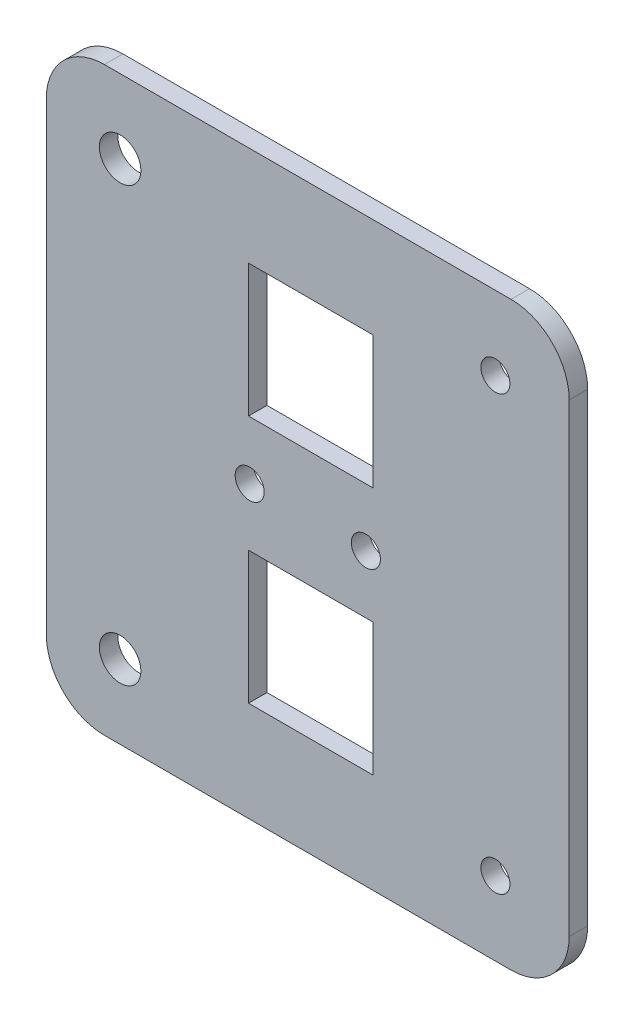
ISO-10303-21;
HEADER;
FILE_DESCRIPTION(('STEP AP214'),'2;1');
FILE_NAME('part.step','',(''),(''),'','','');
FILE_SCHEMA(('AUTOMOTIVE_DESIGN { 1 0 10303 214 1 1 1 1 }'));
ENDSEC;
DATA;
#1=APPLICATION_CONTEXT('core data for automotive mechanical design processes');
#2=APPLICATION_PROTOCOL_DEFINITION('international standard','automotive_design',2000,#1);
#3=PRODUCT_CONTEXT('',#1,'mechanical');
#4=PRODUCT('Part','Part','',(#3));
#5=PRODUCT_RELATED_PRODUCT_CATEGORY('part','',(#4));
#6=PRODUCT_DEFINITION_FORMATION('','',#4);
#7=PRODUCT_DEFINITION_CONTEXT('part definition',#1,'design');
#8=PRODUCT_DEFINITION('design','',#6,#7);
#9=PRODUCT_DEFINITION_SHAPE('','',#8);
#10=(LENGTH_UNIT() NAMED_UNIT(*) SI_UNIT(.MILLI.,.METRE.));
#11=(NAMED_UNIT(*) PLANE_ANGLE_UNIT() SI_UNIT($,.RADIAN.));
#12=(NAMED_UNIT(*) SI_UNIT($,.STERADIAN.) SOLID_ANGLE_UNIT());
#13=UNCERTAINTY_MEASURE_WITH_UNIT(LENGTH_MEASURE(1.E-05),#10,'distance_accuracy_value','');
#14=(GEOMETRIC_REPRESENTATION_CONTEXT(3) GLOBAL_UNCERTAINTY_ASSIGNED_CONTEXT((#13)) GLOBAL_UNIT_ASSIGNED_CONTEXT((#10,
#11,#12)) REPRESENTATION_CONTEXT('',''));
#15=CARTESIAN_POINT('',(0.,0.,0.));
#16=DIRECTION('',(0.,0.,1.));
#17=DIRECTION('',(1.,0.,0.));
#18=AXIS2_PLACEMENT_3D('',#15,#16,#17);
#19=CARTESIAN_POINT('',(-45.,-55.,15.98));
#20=DIRECTION('',(-1.,0.,0.));
#21=DIRECTION('',(0.,0.,1.));
#22=AXIS2_PLACEMENT_3D('',#19,#20,#21);
#23=PLANE('',#22);
#24=DIRECTION('',(0.,-1.,0.));
#25=VECTOR('',#24,1.);
#26=CARTESIAN_POINT('',(-45.,-55.,15.98));
#27=LINE('',#26,#25);
#28=CARTESIAN_POINT('',(-45.,35.,15.98));
#29=VERTEX_POINT('',#28);
#30=CARTESIAN_POINT('',(-45.,-45.,15.98));
#31=VERTEX_POINT('',#30);
#32=EDGE_CURVE('E252',#29,#31,#27,.T.);
#33=ORIENTED_EDGE('',*,*,#32,.T.);
#34=DIRECTION('',(0.,0.,1.));
#35=VECTOR('',#34,1.);
#36=CARTESIAN_POINT('',(-45.,-45.,15.98));
#37=LINE('',#36,#35);
#38=CARTESIAN_POINT('',(-45.,-45.,19.16));
#39=VERTEX_POINT('',#38);
#40=EDGE_CURVE('E303',#31,#39,#37,.T.);
#41=ORIENTED_EDGE('',*,*,#40,.T.);
#42=DIRECTION('',(0.,-1.,0.));
#43=VECTOR('',#42,1.);
#44=CARTESIAN_POINT('',(-45.,-55.,19.16));
#45=LINE('',#44,#43);
#46=CARTESIAN_POINT('',(-45.,35.,19.16));
#47=VERTEX_POINT('',#46);
#48=EDGE_CURVE('E249',#47,#39,#45,.T.);
#49=ORIENTED_EDGE('',*,*,#48,.F.);
#50=DIRECTION('',(0.,0.,1.));
#51=VECTOR('',#50,1.);
#52=CARTESIAN_POINT('',(-45.,35.,15.98));
#53=LINE('',#52,#51);
#54=EDGE_CURVE('E301',#47,#29,#53,.F.);
#55=ORIENTED_EDGE('',*,*,#54,.T.);
#56=EDGE_LOOP('',(#33,#41,#49,#55));
#57=FACE_BOUND('',#56,.T.);
#58=ADVANCED_FACE('F34',(#57),#23,.T.);
#59=CARTESIAN_POINT('',(-45.,45.,15.98));
#60=DIRECTION('',(0.,1.,0.));
#61=DIRECTION('',(0.,0.,1.));
#62=AXIS2_PLACEMENT_3D('',#59,#60,#61);
#63=PLANE('',#62);
#64=DIRECTION('',(-1.,0.,0.));
#65=VECTOR('',#64,1.);
#66=CARTESIAN_POINT('',(-45.,45.,15.98));
#67=LINE('',#66,#65);
#68=CARTESIAN_POINT('',(35.,45.,15.98));
#69=VERTEX_POINT('',#68);
#70=CARTESIAN_POINT('',(-35.,45.,15.98));
#71=VERTEX_POINT('',#70);
#72=EDGE_CURVE('E262',#69,#71,#67,.T.);
#73=ORIENTED_EDGE('',*,*,#72,.T.);
#74=DIRECTION('',(0.,0.,1.));
#75=VECTOR('',#74,1.);
#76=CARTESIAN_POINT('',(-35.,45.,15.98));
#77=LINE('',#76,#75);
#78=CARTESIAN_POINT('',(-35.,45.,19.16));
#79=VERTEX_POINT('',#78);
#80=EDGE_CURVE('E11',#71,#79,#77,.T.);
#81=ORIENTED_EDGE('',*,*,#80,.T.);
#82=DIRECTION('',(-1.,0.,0.));
#83=VECTOR('',#82,1.);
#84=CARTESIAN_POINT('',(-45.,45.,19.16));
#85=LINE('',#84,#83);
#86=CARTESIAN_POINT('',(35.,45.,19.16));
#87=VERTEX_POINT('',#86);
#88=EDGE_CURVE('E256',#87,#79,#85,.T.);
#89=ORIENTED_EDGE('',*,*,#88,.F.);
#90=DIRECTION('',(0.,0.,1.));
#91=VECTOR('',#90,1.);
#92=CARTESIAN_POINT('',(35.,45.,15.98));
#93=LINE('',#92,#91);
#94=EDGE_CURVE('E42',#87,#69,#93,.F.);
#95=ORIENTED_EDGE('',*,*,#94,.T.);
#96=EDGE_LOOP('',(#73,#81,#89,#95));
#97=FACE_BOUND('',#96,.T.);
#98=ADVANCED_FACE('F309',(#97),#63,.T.);
#99=CARTESIAN_POINT('',(45.,-55.,15.98));
#100=DIRECTION('',(1.,0.,0.));
#101=DIRECTION('',(0.,0.,-1.));
#102=AXIS2_PLACEMENT_3D('',#99,#100,#101);
#103=PLANE('',#102);
#104=DIRECTION('',(0.,1.,0.));
#105=VECTOR('',#104,1.);
#106=CARTESIAN_POINT('',(45.,-55.,19.16));
#107=LINE('',#106,#105);
#108=CARTESIAN_POINT('',(45.,-45.,19.16));
#109=VERTEX_POINT('',#108);
#110=CARTESIAN_POINT('',(45.,35.,19.16));
#111=VERTEX_POINT('',#110);
#112=EDGE_CURVE('E271',#109,#111,#107,.T.);
#113=ORIENTED_EDGE('',*,*,#112,.F.);
#114=DIRECTION('',(0.,0.,1.));
#115=VECTOR('',#114,1.);
#116=CARTESIAN_POINT('',(45.,-45.,15.98));
#117=LINE('',#116,#115);
#118=CARTESIAN_POINT('',(45.,-45.,15.98));
#119=VERTEX_POINT('',#118);
#120=EDGE_CURVE('E291',#109,#119,#117,.F.);
#121=ORIENTED_EDGE('',*,*,#120,.T.);
#122=DIRECTION('',(0.,1.,0.));
#123=VECTOR('',#122,1.);
#124=CARTESIAN_POINT('',(45.,-55.,15.98));
#125=LINE('',#124,#123);
#126=CARTESIAN_POINT('',(45.,35.,15.98));
#127=VERTEX_POINT('',#126);
#128=EDGE_CURVE('E259',#119,#127,#125,.T.);
#129=ORIENTED_EDGE('',*,*,#128,.T.);
#130=DIRECTION('',(0.,0.,1.));
#131=VECTOR('',#130,1.);
#132=CARTESIAN_POINT('',(45.,35.,15.98));
#133=LINE('',#132,#131);
#134=EDGE_CURVE('E288',#127,#111,#133,.T.);
#135=ORIENTED_EDGE('',*,*,#134,.T.);
#136=EDGE_LOOP('',(#113,#121,#129,#135));
#137=FACE_BOUND('',#136,.T.);
#138=ADVANCED_FACE('F321',(#137),#103,.T.);
#139=CARTESIAN_POINT('',(-45.,-55.,15.98));
#140=DIRECTION('',(0.,-1.,0.));
#141=DIRECTION('',(0.,0.,-1.));
#142=AXIS2_PLACEMENT_3D('',#139,#140,#141);
#143=PLANE('',#142);
#144=DIRECTION('',(1.,0.,0.));
#145=VECTOR('',#144,1.);
#146=CARTESIAN_POINT('',(-45.,-55.,15.98));
#147=LINE('',#146,#145);
#148=CARTESIAN_POINT('',(-35.,-55.,15.98));
#149=VERTEX_POINT('',#148);
#150=CARTESIAN_POINT('',(35.,-55.,15.98));
#151=VERTEX_POINT('',#150);
#152=EDGE_CURVE('E255',#149,#151,#147,.T.);
#153=ORIENTED_EDGE('',*,*,#152,.T.);
#154=DIRECTION('',(0.,0.,1.));
#155=VECTOR('',#154,1.);
#156=CARTESIAN_POINT('',(35.,-55.,15.98));
#157=LINE('',#156,#155);
#158=CARTESIAN_POINT('',(35.,-55.,19.16));
#159=VERTEX_POINT('',#158);
#160=EDGE_CURVE('E277',#151,#159,#157,.T.);
#161=ORIENTED_EDGE('',*,*,#160,.T.);
#162=DIRECTION('',(1.,0.,0.));
#163=VECTOR('',#162,1.);
#164=CARTESIAN_POINT('',(-45.,-55.,19.16));
#165=LINE('',#164,#163);
#166=CARTESIAN_POINT('',(-35.,-55.,19.16));
#167=VERTEX_POINT('',#166);
#168=EDGE_CURVE('E268',#167,#159,#165,.T.);
#169=ORIENTED_EDGE('',*,*,#168,.F.);
#170=DIRECTION('',(0.,0.,1.));
#171=VECTOR('',#170,1.);
#172=CARTESIAN_POINT('',(-35.,-55.,15.98));
#173=LINE('',#172,#171);
#174=EDGE_CURVE('E265',#167,#149,#173,.F.);
#175=ORIENTED_EDGE('',*,*,#174,.T.);
#176=EDGE_LOOP('',(#153,#161,#169,#175));
#177=FACE_BOUND('',#176,.T.);
#178=ADVANCED_FACE('F330',(#177),#143,.T.);
#179=CARTESIAN_POINT('',(0.,0.,15.98));
#180=DIRECTION('',(0.,0.,-1.));
#181=DIRECTION('',(-1.,0.,0.));
#182=AXIS2_PLACEMENT_3D('',#179,#180,#181);
#183=PLANE('',#182);
#184=DIRECTION('',(0.,1.,0.));
#185=VECTOR('',#184,1.);
#186=CARTESIAN_POINT('',(-10.2,5.00000000123002,15.98));
#187=LINE('',#186,#185);
#188=CARTESIAN_POINT('',(-10.2,5.00000000123002,15.98));
#189=VERTEX_POINT('',#188);
#190=CARTESIAN_POINT('',(-10.2,27.8105107042279,15.98));
#191=VERTEX_POINT('',#190);
#192=EDGE_CURVE('E49',#189,#191,#187,.T.);
#193=ORIENTED_EDGE('',*,*,#192,.F.);
#194=DIRECTION('',(-1.,0.,0.));
#195=VECTOR('',#194,1.);
#196=CARTESIAN_POINT('',(-10.2,5.00000000123002,15.98));
#197=LINE('',#196,#195);
#198=CARTESIAN_POINT('',(11.2,5.00000000123002,15.98));
#199=VERTEX_POINT('',#198);
#200=EDGE_CURVE('E165',#199,#189,#197,.T.);
#201=ORIENTED_EDGE('',*,*,#200,.F.);
#202=DIRECTION('',(0.,-1.,0.));
#203=VECTOR('',#202,1.);
#204=CARTESIAN_POINT('',(11.2,5.00000000123002,15.98));
#205=LINE('',#204,#203);
#206=CARTESIAN_POINT('',(11.2,27.8105107042279,15.98));
#207=VERTEX_POINT('',#206);
#208=EDGE_CURVE('E168',#207,#199,#205,.T.);
#209=ORIENTED_EDGE('',*,*,#208,.F.);
#210=DIRECTION('',(1.,0.,0.));
#211=VECTOR('',#210,1.);
#212=CARTESIAN_POINT('',(-10.2,27.8105107042279,15.98));
#213=LINE('',#212,#211);
#214=EDGE_CURVE('E174',#191,#207,#213,.T.);
#215=ORIENTED_EDGE('',*,*,#214,.F.);
#216=EDGE_LOOP('',(#193,#201,#209,#215));
#217=FACE_BOUND('',#216,.T.);
#218=DIRECTION('',(0.,1.,0.));
#219=VECTOR('',#218,1.);
#220=CARTESIAN_POINT('',(-10.2,-15.0000000012299,15.98));
#221=LINE('',#220,#219);
#222=CARTESIAN_POINT('',(-10.2,-37.8105107042278,15.98));
#223=VERTEX_POINT('',#222);
#224=CARTESIAN_POINT('',(-10.2,-15.0000000012299,15.98));
#225=VERTEX_POINT('',#224);
#226=EDGE_CURVE('E180',#223,#225,#221,.T.);
#227=ORIENTED_EDGE('',*,*,#226,.F.);
#228=DIRECTION('',(-1.,0.,0.));
#229=VECTOR('',#228,1.);
#230=CARTESIAN_POINT('',(-10.2,-37.8105107042278,15.98));
#231=LINE('',#230,#229);
#232=CARTESIAN_POINT('',(11.2,-37.8105107042278,15.98));
#233=VERTEX_POINT('',#232);
#234=EDGE_CURVE('E188',#233,#223,#231,.T.);
#235=ORIENTED_EDGE('',*,*,#234,.F.);
#236=DIRECTION('',(0.,-1.,0.));
#237=VECTOR('',#236,1.);
#238=CARTESIAN_POINT('',(11.2,-15.0000000012299,15.98));
#239=LINE('',#238,#237);
#240=CARTESIAN_POINT('',(11.2,-15.0000000012299,15.98));
#241=VERTEX_POINT('',#240);
#242=EDGE_CURVE('E202',#241,#233,#239,.T.);
#243=ORIENTED_EDGE('',*,*,#242,.F.);
#244=DIRECTION('',(1.,0.,0.));
#245=VECTOR('',#244,1.);
#246=CARTESIAN_POINT('',(-10.2,-15.0000000012299,15.98));
#247=LINE('',#246,#245);
#248=EDGE_CURVE('E199',#225,#241,#247,.T.);
#249=ORIENTED_EDGE('',*,*,#248,.F.);
#250=EDGE_LOOP('',(#227,#235,#243,#249));
#251=FACE_BOUND('',#250,.T.);
#252=CARTESIAN_POINT('',(-9.99999999999999,-4.99999999999996,15.98));
#253=DIRECTION('',(0.,0.,-1.));
#254=DIRECTION('',(-1.,0.,0.));
#255=AXIS2_PLACEMENT_3D('',#252,#253,#254);
#256=CIRCLE('',#255,2.5);
#257=CARTESIAN_POINT('',(-12.5,-4.99999999999996,15.98));
#258=VERTEX_POINT('',#257);
#259=EDGE_CURVE('E218',#258,#258,#256,.T.);
#260=ORIENTED_EDGE('',*,*,#259,.F.);
#261=EDGE_LOOP('',(#260));
#262=FACE_BOUND('',#261,.T.);
#263=CARTESIAN_POINT('',(10.,-4.99999999999995,15.98));
#264=DIRECTION('',(0.,0.,-1.));
#265=DIRECTION('',(-1.,0.,0.));
#266=AXIS2_PLACEMENT_3D('',#263,#264,#265);
#267=CIRCLE('',#266,2.5);
#268=CARTESIAN_POINT('',(7.50000000000001,-4.99999999999995,15.98));
#269=VERTEX_POINT('',#268);
#270=EDGE_CURVE('E224',#269,#269,#267,.T.);
#271=ORIENTED_EDGE('',*,*,#270,.F.);
#272=EDGE_LOOP('',(#271));
#273=FACE_BOUND('',#272,.T.);
#274=CARTESIAN_POINT('',(32.3,32.3000000000001,15.98));
#275=DIRECTION('',(0.,0.,1.));
#276=DIRECTION('',(1.,0.,0.));
#277=AXIS2_PLACEMENT_3D('',#274,#275,#276);
#278=CIRCLE('',#277,2.5);
#279=CARTESIAN_POINT('',(34.8,32.3000000000001,15.98));
#280=VERTEX_POINT('',#279);
#281=EDGE_CURVE('E228',#280,#280,#278,.T.);
#282=ORIENTED_EDGE('',*,*,#281,.T.);
#283=EDGE_LOOP('',(#282));
#284=FACE_BOUND('',#283,.T.);
#285=CARTESIAN_POINT('',(-32.3,32.3,15.98));
#286=DIRECTION('',(0.,0.,1.));
#287=DIRECTION('',(1.,0.,0.));
#288=AXIS2_PLACEMENT_3D('',#285,#286,#287);
#289=CIRCLE('',#288,3.57);
#290=CARTESIAN_POINT('',(-28.73,32.3,15.98));
#291=VERTEX_POINT('',#290);
#292=EDGE_CURVE('E234',#291,#291,#289,.T.);
#293=ORIENTED_EDGE('',*,*,#292,.T.);
#294=EDGE_LOOP('',(#293));
#295=FACE_BOUND('',#294,.T.);
#296=CARTESIAN_POINT('',(-32.3,-42.3,15.98));
#297=DIRECTION('',(0.,0.,1.));
#298=DIRECTION('',(1.,0.,0.));
#299=AXIS2_PLACEMENT_3D('',#296,#297,#298);
#300=CIRCLE('',#299,3.57);
#301=CARTESIAN_POINT('',(-28.73,-42.3,15.98));
#302=VERTEX_POINT('',#301);
#303=EDGE_CURVE('E240',#302,#302,#300,.T.);
#304=ORIENTED_EDGE('',*,*,#303,.T.);
#305=EDGE_LOOP('',(#304));
#306=FACE_BOUND('',#305,.T.);
#307=CARTESIAN_POINT('',(32.3,-42.3,15.98));
#308=DIRECTION('',(0.,0.,1.));
#309=DIRECTION('',(1.,0.,0.));
#310=AXIS2_PLACEMENT_3D('',#307,#308,#309);
#311=CIRCLE('',#310,2.5);
#312=CARTESIAN_POINT('',(34.8,-42.3,15.98));
#313=VERTEX_POINT('',#312);
#314=EDGE_CURVE('E246',#313,#313,#311,.T.);
#315=ORIENTED_EDGE('',*,*,#314,.T.);
#316=EDGE_LOOP('',(#315));
#317=FACE_BOUND('',#316,.T.);
#318=ORIENTED_EDGE('',*,*,#128,.F.);
#319=CARTESIAN_POINT('',(35.,-45.,15.98));
#320=DIRECTION('',(0.,0.,-1.));
#321=DIRECTION('',(-1.,0.,0.));
#322=AXIS2_PLACEMENT_3D('',#319,#320,#321);
#323=CIRCLE('',#322,10.);
#324=EDGE_CURVE('E299',#119,#151,#323,.T.);
#325=ORIENTED_EDGE('',*,*,#324,.T.);
#326=ORIENTED_EDGE('',*,*,#152,.F.);
#327=CARTESIAN_POINT('',(-35.,-45.,15.98));
#328=DIRECTION('',(0.,0.,-1.));
#329=DIRECTION('',(-1.,0.,0.));
#330=AXIS2_PLACEMENT_3D('',#327,#328,#329);
#331=CIRCLE('',#330,10.);
#332=EDGE_CURVE('E297',#149,#31,#331,.T.);
#333=ORIENTED_EDGE('',*,*,#332,.T.);
#334=ORIENTED_EDGE('',*,*,#32,.F.);
#335=CARTESIAN_POINT('',(-35.,35.,15.98));
#336=DIRECTION('',(0.,0.,-1.));
#337=DIRECTION('',(-1.,0.,0.));
#338=AXIS2_PLACEMENT_3D('',#335,#336,#337);
#339=CIRCLE('',#338,10.);
#340=EDGE_CURVE('E295',#29,#71,#339,.T.);
#341=ORIENTED_EDGE('',*,*,#340,.T.);
#342=ORIENTED_EDGE('',*,*,#72,.F.);
#343=CARTESIAN_POINT('',(35.,35.,15.98));
#344=DIRECTION('',(0.,0.,-1.));
#345=DIRECTION('',(-1.,0.,0.));
#346=AXIS2_PLACEMENT_3D('',#343,#344,#345);
#347=CIRCLE('',#346,10.);
#348=EDGE_CURVE('E293',#69,#127,#347,.T.);
#349=ORIENTED_EDGE('',*,*,#348,.T.);
#350=EDGE_LOOP('',(#318,#325,#326,#333,#334,#341,#342,#349));
#351=FACE_BOUND('',#350,.T.);
#352=ADVANCED_FACE('F315',(#217,#251,#262,#273,#284,#295,#306,#317,#351),#183,.T.);
#353=CARTESIAN_POINT('',(0.,0.,19.16));
#354=DIRECTION('',(0.,0.,-1.));
#355=DIRECTION('',(-1.,0.,0.));
#356=AXIS2_PLACEMENT_3D('',#353,#354,#355);
#357=PLANE('',#356);
#358=DIRECTION('',(-1.,0.,0.));
#359=VECTOR('',#358,1.);
#360=CARTESIAN_POINT('',(-10.2,5.00000000123002,19.16));
#361=LINE('',#360,#359);
#362=CARTESIAN_POINT('',(11.2,5.00000000123002,19.16));
#363=VERTEX_POINT('',#362);
#364=CARTESIAN_POINT('',(-10.2,5.00000000123002,19.16));
#365=VERTEX_POINT('',#364);
#366=EDGE_CURVE('E155',#363,#365,#361,.T.);
#367=ORIENTED_EDGE('',*,*,#366,.T.);
#368=DIRECTION('',(0.,1.,0.));
#369=VECTOR('',#368,1.);
#370=CARTESIAN_POINT('',(-10.2,5.00000000123002,19.16));
#371=LINE('',#370,#369);
#372=CARTESIAN_POINT('',(-10.2,27.8105107042279,19.16));
#373=VERTEX_POINT('',#372);
#374=EDGE_CURVE('E149',#365,#373,#371,.T.);
#375=ORIENTED_EDGE('',*,*,#374,.T.);
#376=DIRECTION('',(1.,0.,0.));
#377=VECTOR('',#376,1.);
#378=CARTESIAN_POINT('',(-10.2,27.8105107042279,19.16));
#379=LINE('',#378,#377);
#380=CARTESIAN_POINT('',(11.2,27.8105107042279,19.16));
#381=VERTEX_POINT('',#380);
#382=EDGE_CURVE('E158',#373,#381,#379,.T.);
#383=ORIENTED_EDGE('',*,*,#382,.T.);
#384=DIRECTION('',(0.,-1.,0.));
#385=VECTOR('',#384,1.);
#386=CARTESIAN_POINT('',(11.2,5.00000000123002,19.16));
#387=LINE('',#386,#385);
#388=EDGE_CURVE('E57',#381,#363,#387,.T.);
#389=ORIENTED_EDGE('',*,*,#388,.T.);
#390=EDGE_LOOP('',(#367,#375,#383,#389));
#391=FACE_BOUND('',#390,.T.);
#392=DIRECTION('',(-1.,0.,0.));
#393=VECTOR('',#392,1.);
#394=CARTESIAN_POINT('',(-10.2,-37.8105107042278,19.16));
#395=LINE('',#394,#393);
#396=CARTESIAN_POINT('',(11.2,-37.8105107042278,19.16));
#397=VERTEX_POINT('',#396);
#398=CARTESIAN_POINT('',(-10.2,-37.8105107042278,19.16));
#399=VERTEX_POINT('',#398);
#400=EDGE_CURVE('E194',#397,#399,#395,.T.);
#401=ORIENTED_EDGE('',*,*,#400,.T.);
#402=DIRECTION('',(0.,1.,0.));
#403=VECTOR('',#402,1.);
#404=CARTESIAN_POINT('',(-10.2,-15.0000000012299,19.16));
#405=LINE('',#404,#403);
#406=CARTESIAN_POINT('',(-10.2,-15.0000000012299,19.16));
#407=VERTEX_POINT('',#406);
#408=EDGE_CURVE('E184',#399,#407,#405,.T.);
#409=ORIENTED_EDGE('',*,*,#408,.T.);
#410=DIRECTION('',(1.,0.,0.));
#411=VECTOR('',#410,1.);
#412=CARTESIAN_POINT('',(-10.2,-15.0000000012299,19.16));
#413=LINE('',#412,#411);
#414=CARTESIAN_POINT('',(11.2,-15.0000000012299,19.16));
#415=VERTEX_POINT('',#414);
#416=EDGE_CURVE('E187',#407,#415,#413,.T.);
#417=ORIENTED_EDGE('',*,*,#416,.T.);
#418=DIRECTION('',(0.,-1.,0.));
#419=VECTOR('',#418,1.);
#420=CARTESIAN_POINT('',(11.2,-15.0000000012299,19.16));
#421=LINE('',#420,#419);
#422=EDGE_CURVE('E191',#415,#397,#421,.T.);
#423=ORIENTED_EDGE('',*,*,#422,.T.);
#424=EDGE_LOOP('',(#401,#409,#417,#423));
#425=FACE_BOUND('',#424,.T.);
#426=CARTESIAN_POINT('',(-9.99999999999999,-4.99999999999996,19.16));
#427=DIRECTION('',(0.,0.,1.));
#428=DIRECTION('',(1.,0.,0.));
#429=AXIS2_PLACEMENT_3D('',#426,#427,#428);
#430=CIRCLE('',#429,2.5);
#431=CARTESIAN_POINT('',(-7.49999999999999,-4.99999999999996,19.16));
#432=VERTEX_POINT('',#431);
#433=EDGE_CURVE('E209',#432,#432,#430,.T.);
#434=ORIENTED_EDGE('',*,*,#433,.F.);
#435=EDGE_LOOP('',(#434));
#436=FACE_BOUND('',#435,.T.);
#437=CARTESIAN_POINT('',(10.,-4.99999999999995,19.16));
#438=DIRECTION('',(0.,0.,1.));
#439=DIRECTION('',(1.,0.,0.));
#440=AXIS2_PLACEMENT_3D('',#437,#438,#439);
#441=CIRCLE('',#440,2.5);
#442=CARTESIAN_POINT('',(12.5,-4.99999999999995,19.16));
#443=VERTEX_POINT('',#442);
#444=EDGE_CURVE('E221',#443,#443,#441,.T.);
#445=ORIENTED_EDGE('',*,*,#444,.F.);
#446=EDGE_LOOP('',(#445));
#447=FACE_BOUND('',#446,.T.);
#448=CARTESIAN_POINT('',(32.3,32.3000000000001,19.16));
#449=DIRECTION('',(0.,0.,1.));
#450=DIRECTION('',(1.,0.,0.));
#451=AXIS2_PLACEMENT_3D('',#448,#449,#450);
#452=CIRCLE('',#451,2.5);
#453=CARTESIAN_POINT('',(34.8,32.3000000000001,19.16));
#454=VERTEX_POINT('',#453);
#455=EDGE_CURVE('E227',#454,#454,#452,.T.);
#456=ORIENTED_EDGE('',*,*,#455,.F.);
#457=EDGE_LOOP('',(#456));
#458=FACE_BOUND('',#457,.T.);
#459=CARTESIAN_POINT('',(-32.3,32.3,19.16));
#460=DIRECTION('',(0.,0.,1.));
#461=DIRECTION('',(1.,0.,0.));
#462=AXIS2_PLACEMENT_3D('',#459,#460,#461);
#463=CIRCLE('',#462,3.57);
#464=CARTESIAN_POINT('',(-28.73,32.3,19.16));
#465=VERTEX_POINT('',#464);
#466=EDGE_CURVE('E231',#465,#465,#463,.T.);
#467=ORIENTED_EDGE('',*,*,#466,.F.);
#468=EDGE_LOOP('',(#467));
#469=FACE_BOUND('',#468,.T.);
#470=CARTESIAN_POINT('',(-32.3,-42.3,19.16));
#471=DIRECTION('',(0.,0.,1.));
#472=DIRECTION('',(1.,0.,0.));
#473=AXIS2_PLACEMENT_3D('',#470,#471,#472);
#474=CIRCLE('',#473,3.57);
#475=CARTESIAN_POINT('',(-28.73,-42.3,19.16));
#476=VERTEX_POINT('',#475);
#477=EDGE_CURVE('E237',#476,#476,#474,.T.);
#478=ORIENTED_EDGE('',*,*,#477,.F.);
#479=EDGE_LOOP('',(#478));
#480=FACE_BOUND('',#479,.T.);
#481=CARTESIAN_POINT('',(32.3,-42.3,19.16));
#482=DIRECTION('',(0.,0.,1.));
#483=DIRECTION('',(1.,0.,0.));
#484=AXIS2_PLACEMENT_3D('',#481,#482,#483);
#485=CIRCLE('',#484,2.5);
#486=CARTESIAN_POINT('',(34.8,-42.3,19.16));
#487=VERTEX_POINT('',#486);
#488=EDGE_CURVE('E243',#487,#487,#485,.T.);
#489=ORIENTED_EDGE('',*,*,#488,.F.);
#490=EDGE_LOOP('',(#489));
#491=FACE_BOUND('',#490,.T.);
#492=ORIENTED_EDGE('',*,*,#168,.T.);
#493=CARTESIAN_POINT('',(35.,-45.,19.16));
#494=DIRECTION('',(0.,0.,-1.));
#495=DIRECTION('',(-1.,0.,0.));
#496=AXIS2_PLACEMENT_3D('',#493,#494,#495);
#497=CIRCLE('',#496,10.);
#498=EDGE_CURVE('E286',#159,#109,#497,.F.);
#499=ORIENTED_EDGE('',*,*,#498,.T.);
#500=ORIENTED_EDGE('',*,*,#112,.T.);
#501=CARTESIAN_POINT('',(35.,35.,19.16));
#502=DIRECTION('',(0.,0.,-1.));
#503=DIRECTION('',(-1.,0.,0.));
#504=AXIS2_PLACEMENT_3D('',#501,#502,#503);
#505=CIRCLE('',#504,10.);
#506=EDGE_CURVE('E280',#111,#87,#505,.F.);
#507=ORIENTED_EDGE('',*,*,#506,.T.);
#508=ORIENTED_EDGE('',*,*,#88,.T.);
#509=CARTESIAN_POINT('',(-35.,35.,19.16));
#510=DIRECTION('',(0.,0.,-1.));
#511=DIRECTION('',(-1.,0.,0.));
#512=AXIS2_PLACEMENT_3D('',#509,#510,#511);
#513=CIRCLE('',#512,10.);
#514=EDGE_CURVE('E282',#79,#47,#513,.F.);
#515=ORIENTED_EDGE('',*,*,#514,.T.);
#516=ORIENTED_EDGE('',*,*,#48,.T.);
#517=CARTESIAN_POINT('',(-35.,-45.,19.16));
#518=DIRECTION('',(0.,0.,-1.));
#519=DIRECTION('',(-1.,0.,0.));
#520=AXIS2_PLACEMENT_3D('',#517,#518,#519);
#521=CIRCLE('',#520,10.);
#522=EDGE_CURVE('E284',#39,#167,#521,.F.);
#523=ORIENTED_EDGE('',*,*,#522,.T.);
#524=EDGE_LOOP('',(#492,#499,#500,#507,#508,#515,#516,#523));
#525=FACE_BOUND('',#524,.T.);
#526=ADVANCED_FACE('F162',(#391,#425,#436,#447,#458,#469,#480,#491,#525),#357,.F.);
#527=CARTESIAN_POINT('',(32.3,-42.3,15.98));
#528=DIRECTION('',(0.,0.,1.));
#529=DIRECTION('',(1.,0.,0.));
#530=AXIS2_PLACEMENT_3D('',#527,#528,#529);
#531=CYLINDRICAL_SURFACE('',#530,2.5);
#532=CARTESIAN_POINT('',(34.8,-42.3,15.98));
#533=CARTESIAN_POINT('',(34.8,-42.3,16.013125));
#534=CARTESIAN_POINT('',(34.8,-42.3,16.04625));
#535=CARTESIAN_POINT('',(34.8,-42.3,16.1125));
#536=CARTESIAN_POINT('',(34.8,-42.3,16.145625));
#537=CARTESIAN_POINT('',(34.8,-42.3,16.211875));
#538=CARTESIAN_POINT('',(34.8,-42.3,16.245));
#539=CARTESIAN_POINT('',(34.8,-42.3,16.31125));
#540=CARTESIAN_POINT('',(34.8,-42.3,16.344375));
#541=CARTESIAN_POINT('',(34.8,-42.3,16.410625));
#542=CARTESIAN_POINT('',(34.8,-42.3,16.44375));
#543=CARTESIAN_POINT('',(34.8,-42.3,16.51));
#544=CARTESIAN_POINT('',(34.8,-42.3,16.543125));
#545=CARTESIAN_POINT('',(34.8,-42.3,16.609375));
#546=CARTESIAN_POINT('',(34.8,-42.3,16.6425));
#547=CARTESIAN_POINT('',(34.8,-42.3,16.70875));
#548=CARTESIAN_POINT('',(34.8,-42.3,16.741875));
#549=CARTESIAN_POINT('',(34.8,-42.3,16.808125));
#550=CARTESIAN_POINT('',(34.8,-42.3,16.84125));
#551=CARTESIAN_POINT('',(34.8,-42.3,16.9075));
#552=CARTESIAN_POINT('',(34.8,-42.3,16.940625));
#553=CARTESIAN_POINT('',(34.8,-42.3,17.006875));
#554=CARTESIAN_POINT('',(34.8,-42.3,17.04));
#555=CARTESIAN_POINT('',(34.8,-42.3,17.10625));
#556=CARTESIAN_POINT('',(34.8,-42.3,17.139375));
#557=CARTESIAN_POINT('',(34.8,-42.3,17.205625));
#558=CARTESIAN_POINT('',(34.8,-42.3,17.23875));
#559=CARTESIAN_POINT('',(34.8,-42.3,17.305));
#560=CARTESIAN_POINT('',(34.8,-42.3,17.338125));
#561=CARTESIAN_POINT('',(34.8,-42.3,17.404375));
#562=CARTESIAN_POINT('',(34.8,-42.3,17.4375));
#563=CARTESIAN_POINT('',(34.8,-42.3,17.50375));
#564=CARTESIAN_POINT('',(34.8,-42.3,17.536875));
#565=CARTESIAN_POINT('',(34.8,-42.3,17.603125));
#566=CARTESIAN_POINT('',(34.8,-42.3,17.63625));
#567=CARTESIAN_POINT('',(34.8,-42.3,17.7025));
#568=CARTESIAN_POINT('',(34.8,-42.3,17.735625));
#569=CARTESIAN_POINT('',(34.8,-42.3,17.801875));
#570=CARTESIAN_POINT('',(34.8,-42.3,17.835));
#571=CARTESIAN_POINT('',(34.8,-42.3,17.90125));
#572=CARTESIAN_POINT('',(34.8,-42.3,17.934375));
#573=CARTESIAN_POINT('',(34.8,-42.3,18.000625));
#574=CARTESIAN_POINT('',(34.8,-42.3,18.03375));
#575=CARTESIAN_POINT('',(34.8,-42.3,18.1));
#576=CARTESIAN_POINT('',(34.8,-42.3,18.133125));
#577=CARTESIAN_POINT('',(34.8,-42.3,18.199375));
#578=CARTESIAN_POINT('',(34.8,-42.3,18.2325));
#579=CARTESIAN_POINT('',(34.8,-42.3,18.29875));
#580=CARTESIAN_POINT('',(34.8,-42.3,18.331875));
#581=CARTESIAN_POINT('',(34.8,-42.3,18.398125));
#582=CARTESIAN_POINT('',(34.8,-42.3,18.43125));
#583=CARTESIAN_POINT('',(34.8,-42.3,18.4975));
#584=CARTESIAN_POINT('',(34.8,-42.3,18.530625));
#585=CARTESIAN_POINT('',(34.8,-42.3,18.596875));
#586=CARTESIAN_POINT('',(34.8,-42.3,18.63));
#587=CARTESIAN_POINT('',(34.8,-42.3,18.69625));
#588=CARTESIAN_POINT('',(34.8,-42.3,18.729375));
#589=CARTESIAN_POINT('',(34.8,-42.3,18.795625));
#590=CARTESIAN_POINT('',(34.8,-42.3,18.82875));
#591=CARTESIAN_POINT('',(34.8,-42.3,18.895));
#592=CARTESIAN_POINT('',(34.8,-42.3,18.928125));
#593=CARTESIAN_POINT('',(34.8,-42.3,18.994375));
#594=CARTESIAN_POINT('',(34.8,-42.3,19.0275));
#595=CARTESIAN_POINT('',(34.8,-42.3,19.09375));
#596=CARTESIAN_POINT('',(34.8,-42.3,19.126875));
#597=CARTESIAN_POINT('',(34.8,-42.3,19.16));
#598=B_SPLINE_CURVE_WITH_KNOTS('',3,(#532,#533,#534,#535,#536,#537,#538,#539,#540,#541,#542,
#543,#544,#545,#546,#547,#548,#549,#550,#551,#552,#553,#554,#555,#556,#557,#558,#559,#560,#561,
#562,#563,#564,#565,#566,#567,#568,#569,#570,#571,#572,#573,#574,#575,#576,#577,#578,#579,#580,
#581,#582,#583,#584,#585,#586,#587,#588,#589,#590,#591,#592,#593,#594,#595,#596,#597),
.UNSPECIFIED.,.F.,.F.,(4,2,2,2,2,2,2,2,2,2,2,2,2,2,2,2,2,2,2,2,2,2,2,2,2,2,2,2,2,2,2,2,4),(0.,
0.0993749999999988,0.198749999999998,0.298125,0.397499999999999,0.496874999999997,0.59625,
0.695624999999998,0.794999999999997,0.894374999999999,0.993749999999998,1.093125,1.1925,
1.291875,1.39125,1.490625,1.59,1.689375,1.78875,1.888125,1.9875,2.086875,2.18625,2.285625,2.385,
2.484375,2.58375,2.683125,2.7825,2.881875,2.98125,3.080625,3.18),.UNSPECIFIED.);
#599=EDGE_CURVE('BSEAM379',#313,#487,#598,.T.);
#600=ORIENTED_EDGE('',*,*,#314,.F.);
#601=ORIENTED_EDGE('',*,*,#488,.T.);
#602=ORIENTED_EDGE('',*,*,#599,.T.);
#603=ORIENTED_EDGE('',*,*,#599,.F.);
#604=EDGE_LOOP('',(#600,#602,#601,#603));
#605=FACE_BOUND('',#604,.T.);
#606=ADVANCED_FACE('F379',(#605),#531,.F.);
#607=CARTESIAN_POINT('',(-32.3,-42.3,15.98));
#608=DIRECTION('',(0.,0.,1.));
#609=DIRECTION('',(1.,0.,0.));
#610=AXIS2_PLACEMENT_3D('',#607,#608,#609);
#611=CYLINDRICAL_SURFACE('',#610,3.57);
#612=CARTESIAN_POINT('',(-28.73,-42.3,15.98));
#613=CARTESIAN_POINT('',(-28.73,-42.3,16.013125));
#614=CARTESIAN_POINT('',(-28.73,-42.3,16.04625));
#615=CARTESIAN_POINT('',(-28.73,-42.3,16.1125));
#616=CARTESIAN_POINT('',(-28.73,-42.3,16.145625));
#617=CARTESIAN_POINT('',(-28.73,-42.3,16.211875));
#618=CARTESIAN_POINT('',(-28.73,-42.3,16.245));
#619=CARTESIAN_POINT('',(-28.73,-42.3,16.31125));
#620=CARTESIAN_POINT('',(-28.73,-42.3,16.344375));
#621=CARTESIAN_POINT('',(-28.73,-42.3,16.410625));
#622=CARTESIAN_POINT('',(-28.73,-42.3,16.44375));
#623=CARTESIAN_POINT('',(-28.73,-42.3,16.51));
#624=CARTESIAN_POINT('',(-28.73,-42.3,16.543125));
#625=CARTESIAN_POINT('',(-28.73,-42.3,16.609375));
#626=CARTESIAN_POINT('',(-28.73,-42.3,16.6425));
#627=CARTESIAN_POINT('',(-28.73,-42.3,16.70875));
#628=CARTESIAN_POINT('',(-28.73,-42.3,16.741875));
#629=CARTESIAN_POINT('',(-28.73,-42.3,16.808125));
#630=CARTESIAN_POINT('',(-28.73,-42.3,16.84125));
#631=CARTESIAN_POINT('',(-28.73,-42.3,16.9075));
#632=CARTESIAN_POINT('',(-28.73,-42.3,16.940625));
#633=CARTESIAN_POINT('',(-28.73,-42.3,17.006875));
#634=CARTESIAN_POINT('',(-28.73,-42.3,17.04));
#635=CARTESIAN_POINT('',(-28.73,-42.3,17.10625));
#636=CARTESIAN_POINT('',(-28.73,-42.3,17.139375));
#637=CARTESIAN_POINT('',(-28.73,-42.3,17.205625));
#638=CARTESIAN_POINT('',(-28.73,-42.3,17.23875));
#639=CARTESIAN_POINT('',(-28.73,-42.3,17.305));
#640=CARTESIAN_POINT('',(-28.73,-42.3,17.338125));
#641=CARTESIAN_POINT('',(-28.73,-42.3,17.404375));
#642=CARTESIAN_POINT('',(-28.73,-42.3,17.4375));
#643=CARTESIAN_POINT('',(-28.73,-42.3,17.50375));
#644=CARTESIAN_POINT('',(-28.73,-42.3,17.536875));
#645=CARTESIAN_POINT('',(-28.73,-42.3,17.603125));
#646=CARTESIAN_POINT('',(-28.73,-42.3,17.63625));
#647=CARTESIAN_POINT('',(-28.73,-42.3,17.7025));
#648=CARTESIAN_POINT('',(-28.73,-42.3,17.735625));
#649=CARTESIAN_POINT('',(-28.73,-42.3,17.801875));
#650=CARTESIAN_POINT('',(-28.73,-42.3,17.835));
#651=CARTESIAN_POINT('',(-28.73,-42.3,17.90125));
#652=CARTESIAN_POINT('',(-28.73,-42.3,17.934375));
#653=CARTESIAN_POINT('',(-28.73,-42.3,18.000625));
#654=CARTESIAN_POINT('',(-28.73,-42.3,18.03375));
#655=CARTESIAN_POINT('',(-28.73,-42.3,18.1));
#656=CARTESIAN_POINT('',(-28.73,-42.3,18.133125));
#657=CARTESIAN_POINT('',(-28.73,-42.3,18.199375));
#658=CARTESIAN_POINT('',(-28.73,-42.3,18.2325));
#659=CARTESIAN_POINT('',(-28.73,-42.3,18.29875));
#660=CARTESIAN_POINT('',(-28.73,-42.3,18.331875));
#661=CARTESIAN_POINT('',(-28.73,-42.3,18.398125));
#662=CARTESIAN_POINT('',(-28.73,-42.3,18.43125));
#663=CARTESIAN_POINT('',(-28.73,-42.3,18.4975));
#664=CARTESIAN_POINT('',(-28.73,-42.3,18.530625));
#665=CARTESIAN_POINT('',(-28.73,-42.3,18.596875));
#666=CARTESIAN_POINT('',(-28.73,-42.3,18.63));
#667=CARTESIAN_POINT('',(-28.73,-42.3,18.69625));
#668=CARTESIAN_POINT('',(-28.73,-42.3,18.729375));
#669=CARTESIAN_POINT('',(-28.73,-42.3,18.795625));
#670=CARTESIAN_POINT('',(-28.73,-42.3,18.82875));
#671=CARTESIAN_POINT('',(-28.73,-42.3,18.895));
#672=CARTESIAN_POINT('',(-28.73,-42.3,18.928125));
#673=CARTESIAN_POINT('',(-28.73,-42.3,18.994375));
#674=CARTESIAN_POINT('',(-28.73,-42.3,19.0275));
#675=CARTESIAN_POINT('',(-28.73,-42.3,19.09375));
#676=CARTESIAN_POINT('',(-28.73,-42.3,19.126875));
#677=CARTESIAN_POINT('',(-28.73,-42.3,19.16));
#678=B_SPLINE_CURVE_WITH_KNOTS('',3,(#612,#613,#614,#615,#616,#617,#618,#619,#620,#621,#622,
#623,#624,#625,#626,#627,#628,#629,#630,#631,#632,#633,#634,#635,#636,#637,#638,#639,#640,#641,
#642,#643,#644,#645,#646,#647,#648,#649,#650,#651,#652,#653,#654,#655,#656,#657,#658,#659,#660,
#661,#662,#663,#664,#665,#666,#667,#668,#669,#670,#671,#672,#673,#674,#675,#676,#677),
.UNSPECIFIED.,.F.,.F.,(4,2,2,2,2,2,2,2,2,2,2,2,2,2,2,2,2,2,2,2,2,2,2,2,2,2,2,2,2,2,2,2,4),(0.,
0.0993749999999988,0.198749999999998,0.298125,0.397499999999999,0.496874999999997,0.59625,
0.695624999999998,0.794999999999997,0.894374999999999,0.993749999999998,1.093125,1.1925,
1.291875,1.39125,1.490625,1.59,1.689375,1.78875,1.888125,1.9875,2.086875,2.18625,2.285625,2.385,
2.484375,2.58375,2.683125,2.7825,2.881875,2.98125,3.080625,3.18),.UNSPECIFIED.);
#679=EDGE_CURVE('BSEAM369',#302,#476,#678,.T.);
#680=ORIENTED_EDGE('',*,*,#303,.F.);
#681=ORIENTED_EDGE('',*,*,#477,.T.);
#682=ORIENTED_EDGE('',*,*,#679,.T.);
#683=ORIENTED_EDGE('',*,*,#679,.F.);
#684=EDGE_LOOP('',(#680,#682,#681,#683));
#685=FACE_BOUND('',#684,.T.);
#686=ADVANCED_FACE('F369',(#685),#611,.F.);
#687=CARTESIAN_POINT('',(-32.3,32.3,15.98));
#688=DIRECTION('',(0.,0.,1.));
#689=DIRECTION('',(1.,0.,0.));
#690=AXIS2_PLACEMENT_3D('',#687,#688,#689);
#691=CYLINDRICAL_SURFACE('',#690,3.57);
#692=CARTESIAN_POINT('',(-28.73,32.3,15.98));
#693=CARTESIAN_POINT('',(-28.73,32.3,16.013125));
#694=CARTESIAN_POINT('',(-28.73,32.3,16.04625));
#695=CARTESIAN_POINT('',(-28.73,32.3,16.1125));
#696=CARTESIAN_POINT('',(-28.73,32.3,16.145625));
#697=CARTESIAN_POINT('',(-28.73,32.3,16.211875));
#698=CARTESIAN_POINT('',(-28.73,32.3,16.245));
#699=CARTESIAN_POINT('',(-28.73,32.3,16.31125));
#700=CARTESIAN_POINT('',(-28.73,32.3,16.344375));
#701=CARTESIAN_POINT('',(-28.73,32.3,16.410625));
#702=CARTESIAN_POINT('',(-28.73,32.3,16.44375));
#703=CARTESIAN_POINT('',(-28.73,32.3,16.51));
#704=CARTESIAN_POINT('',(-28.73,32.3,16.543125));
#705=CARTESIAN_POINT('',(-28.73,32.3,16.609375));
#706=CARTESIAN_POINT('',(-28.73,32.3,16.6425));
#707=CARTESIAN_POINT('',(-28.73,32.3,16.70875));
#708=CARTESIAN_POINT('',(-28.73,32.3,16.741875));
#709=CARTESIAN_POINT('',(-28.73,32.3,16.808125));
#710=CARTESIAN_POINT('',(-28.73,32.3,16.84125));
#711=CARTESIAN_POINT('',(-28.73,32.3,16.9075));
#712=CARTESIAN_POINT('',(-28.73,32.3,16.940625));
#713=CARTESIAN_POINT('',(-28.73,32.3,17.006875));
#714=CARTESIAN_POINT('',(-28.73,32.3,17.04));
#715=CARTESIAN_POINT('',(-28.73,32.3,17.10625));
#716=CARTESIAN_POINT('',(-28.73,32.3,17.139375));
#717=CARTESIAN_POINT('',(-28.73,32.3,17.205625));
#718=CARTESIAN_POINT('',(-28.73,32.3,17.23875));
#719=CARTESIAN_POINT('',(-28.73,32.3,17.305));
#720=CARTESIAN_POINT('',(-28.73,32.3,17.338125));
#721=CARTESIAN_POINT('',(-28.73,32.3,17.404375));
#722=CARTESIAN_POINT('',(-28.73,32.3,17.4375));
#723=CARTESIAN_POINT('',(-28.73,32.3,17.50375));
#724=CARTESIAN_POINT('',(-28.73,32.3,17.536875));
#725=CARTESIAN_POINT('',(-28.73,32.3,17.603125));
#726=CARTESIAN_POINT('',(-28.73,32.3,17.63625));
#727=CARTESIAN_POINT('',(-28.73,32.3,17.7025));
#728=CARTESIAN_POINT('',(-28.73,32.3,17.735625));
#729=CARTESIAN_POINT('',(-28.73,32.3,17.801875));
#730=CARTESIAN_POINT('',(-28.73,32.3,17.835));
#731=CARTESIAN_POINT('',(-28.73,32.3,17.90125));
#732=CARTESIAN_POINT('',(-28.73,32.3,17.934375));
#733=CARTESIAN_POINT('',(-28.73,32.3,18.000625));
#734=CARTESIAN_POINT('',(-28.73,32.3,18.03375));
#735=CARTESIAN_POINT('',(-28.73,32.3,18.1));
#736=CARTESIAN_POINT('',(-28.73,32.3,18.133125));
#737=CARTESIAN_POINT('',(-28.73,32.3,18.199375));
#738=CARTESIAN_POINT('',(-28.73,32.3,18.2325));
#739=CARTESIAN_POINT('',(-28.73,32.3,18.29875));
#740=CARTESIAN_POINT('',(-28.73,32.3,18.331875));
#741=CARTESIAN_POINT('',(-28.73,32.3,18.398125));
#742=CARTESIAN_POINT('',(-28.73,32.3,18.43125));
#743=CARTESIAN_POINT('',(-28.73,32.3,18.4975));
#744=CARTESIAN_POINT('',(-28.73,32.3,18.530625));
#745=CARTESIAN_POINT('',(-28.73,32.3,18.596875));
#746=CARTESIAN_POINT('',(-28.73,32.3,18.63));
#747=CARTESIAN_POINT('',(-28.73,32.3,18.69625));
#748=CARTESIAN_POINT('',(-28.73,32.3,18.729375));
#749=CARTESIAN_POINT('',(-28.73,32.3,18.795625));
#750=CARTESIAN_POINT('',(-28.73,32.3,18.82875));
#751=CARTESIAN_POINT('',(-28.73,32.3,18.895));
#752=CARTESIAN_POINT('',(-28.73,32.3,18.928125));
#753=CARTESIAN_POINT('',(-28.73,32.3,18.994375));
#754=CARTESIAN_POINT('',(-28.73,32.3,19.0275));
#755=CARTESIAN_POINT('',(-28.73,32.3,19.09375));
#756=CARTESIAN_POINT('',(-28.73,32.3,19.126875));
#757=CARTESIAN_POINT('',(-28.73,32.3,19.16));
#758=B_SPLINE_CURVE_WITH_KNOTS('',3,(#692,#693,#694,#695,#696,#697,#698,#699,#700,#701,#702,
#703,#704,#705,#706,#707,#708,#709,#710,#711,#712,#713,#714,#715,#716,#717,#718,#719,#720,#721,
#722,#723,#724,#725,#726,#727,#728,#729,#730,#731,#732,#733,#734,#735,#736,#737,#738,#739,#740,
#741,#742,#743,#744,#745,#746,#747,#748,#749,#750,#751,#752,#753,#754,#755,#756,#757),
.UNSPECIFIED.,.F.,.F.,(4,2,2,2,2,2,2,2,2,2,2,2,2,2,2,2,2,2,2,2,2,2,2,2,2,2,2,2,2,2,2,2,4),(0.,
0.0993749999999988,0.198749999999998,0.298125,0.397499999999999,0.496874999999997,0.59625,
0.695624999999998,0.794999999999997,0.894374999999999,0.993749999999998,1.093125,1.1925,
1.291875,1.39125,1.490625,1.59,1.689375,1.78875,1.888125,1.9875,2.086875,2.18625,2.285625,2.385,
2.484375,2.58375,2.683125,2.7825,2.881875,2.98125,3.080625,3.18),.UNSPECIFIED.);
#759=EDGE_CURVE('BSEAM363',#291,#465,#758,.T.);
#760=ORIENTED_EDGE('',*,*,#292,.F.);
#761=ORIENTED_EDGE('',*,*,#466,.T.);
#762=ORIENTED_EDGE('',*,*,#759,.T.);
#763=ORIENTED_EDGE('',*,*,#759,.F.);
#764=EDGE_LOOP('',(#760,#762,#761,#763));
#765=FACE_BOUND('',#764,.T.);
#766=ADVANCED_FACE('F363',(#765),#691,.F.);
#767=CARTESIAN_POINT('',(32.3,32.3000000000001,15.98));
#768=DIRECTION('',(0.,0.,1.));
#769=DIRECTION('',(1.,0.,0.));
#770=AXIS2_PLACEMENT_3D('',#767,#768,#769);
#771=CYLINDRICAL_SURFACE('',#770,2.5);
#772=CARTESIAN_POINT('',(34.8,32.3000000000001,15.98));
#773=CARTESIAN_POINT('',(34.8,32.3000000000001,16.013125));
#774=CARTESIAN_POINT('',(34.8,32.3000000000001,16.04625));
#775=CARTESIAN_POINT('',(34.8,32.3000000000001,16.1125));
#776=CARTESIAN_POINT('',(34.8,32.3000000000001,16.145625));
#777=CARTESIAN_POINT('',(34.8,32.3000000000001,16.211875));
#778=CARTESIAN_POINT('',(34.8,32.3000000000001,16.245));
#779=CARTESIAN_POINT('',(34.8,32.3000000000001,16.31125));
#780=CARTESIAN_POINT('',(34.8,32.3000000000001,16.344375));
#781=CARTESIAN_POINT('',(34.8,32.3000000000001,16.410625));
#782=CARTESIAN_POINT('',(34.8,32.3000000000001,16.44375));
#783=CARTESIAN_POINT('',(34.8,32.3000000000001,16.51));
#784=CARTESIAN_POINT('',(34.8,32.3000000000001,16.543125));
#785=CARTESIAN_POINT('',(34.8,32.3000000000001,16.609375));
#786=CARTESIAN_POINT('',(34.8,32.3000000000001,16.6425));
#787=CARTESIAN_POINT('',(34.8,32.3000000000001,16.70875));
#788=CARTESIAN_POINT('',(34.8,32.3000000000001,16.741875));
#789=CARTESIAN_POINT('',(34.8,32.3000000000001,16.808125));
#790=CARTESIAN_POINT('',(34.8,32.3000000000001,16.84125));
#791=CARTESIAN_POINT('',(34.8,32.3000000000001,16.9075));
#792=CARTESIAN_POINT('',(34.8,32.3000000000001,16.940625));
#793=CARTESIAN_POINT('',(34.8,32.3000000000001,17.006875));
#794=CARTESIAN_POINT('',(34.8,32.3000000000001,17.04));
#795=CARTESIAN_POINT('',(34.8,32.3000000000001,17.10625));
#796=CARTESIAN_POINT('',(34.8,32.3000000000001,17.139375));
#797=CARTESIAN_POINT('',(34.8,32.3000000000001,17.205625));
#798=CARTESIAN_POINT('',(34.8,32.3000000000001,17.23875));
#799=CARTESIAN_POINT('',(34.8,32.3000000000001,17.305));
#800=CARTESIAN_POINT('',(34.8,32.3000000000001,17.338125));
#801=CARTESIAN_POINT('',(34.8,32.3000000000001,17.404375));
#802=CARTESIAN_POINT('',(34.8,32.3000000000001,17.4375));
#803=CARTESIAN_POINT('',(34.8,32.3000000000001,17.50375));
#804=CARTESIAN_POINT('',(34.8,32.3000000000001,17.536875));
#805=CARTESIAN_POINT('',(34.8,32.3000000000001,17.603125));
#806=CARTESIAN_POINT('',(34.8,32.3000000000001,17.63625));
#807=CARTESIAN_POINT('',(34.8,32.3000000000001,17.7025));
#808=CARTESIAN_POINT('',(34.8,32.3000000000001,17.735625));
#809=CARTESIAN_POINT('',(34.8,32.3000000000001,17.801875));
#810=CARTESIAN_POINT('',(34.8,32.3000000000001,17.835));
#811=CARTESIAN_POINT('',(34.8,32.3000000000001,17.90125));
#812=CARTESIAN_POINT('',(34.8,32.3000000000001,17.934375));
#813=CARTESIAN_POINT('',(34.8,32.3000000000001,18.000625));
#814=CARTESIAN_POINT('',(34.8,32.3000000000001,18.03375));
#815=CARTESIAN_POINT('',(34.8,32.3000000000001,18.1));
#816=CARTESIAN_POINT('',(34.8,32.3000000000001,18.133125));
#817=CARTESIAN_POINT('',(34.8,32.3000000000001,18.199375));
#818=CARTESIAN_POINT('',(34.8,32.3000000000001,18.2325));
#819=CARTESIAN_POINT('',(34.8,32.3000000000001,18.29875));
#820=CARTESIAN_POINT('',(34.8,32.3000000000001,18.331875));
#821=CARTESIAN_POINT('',(34.8,32.3000000000001,18.398125));
#822=CARTESIAN_POINT('',(34.8,32.3000000000001,18.43125));
#823=CARTESIAN_POINT('',(34.8,32.3000000000001,18.4975));
#824=CARTESIAN_POINT('',(34.8,32.3000000000001,18.530625));
#825=CARTESIAN_POINT('',(34.8,32.3000000000001,18.596875));
#826=CARTESIAN_POINT('',(34.8,32.3000000000001,18.63));
#827=CARTESIAN_POINT('',(34.8,32.3000000000001,18.69625));
#828=CARTESIAN_POINT('',(34.8,32.3000000000001,18.729375));
#829=CARTESIAN_POINT('',(34.8,32.3000000000001,18.795625));
#830=CARTESIAN_POINT('',(34.8,32.3000000000001,18.82875));
#831=CARTESIAN_POINT('',(34.8,32.3000000000001,18.895));
#832=CARTESIAN_POINT('',(34.8,32.3000000000001,18.928125));
#833=CARTESIAN_POINT('',(34.8,32.3000000000001,18.994375));
#834=CARTESIAN_POINT('',(34.8,32.3000000000001,19.0275));
#835=CARTESIAN_POINT('',(34.8,32.3000000000001,19.09375));
#836=CARTESIAN_POINT('',(34.8,32.3000000000001,19.126875));
#837=CARTESIAN_POINT('',(34.8,32.3000000000001,19.16));
#838=B_SPLINE_CURVE_WITH_KNOTS('',3,(#772,#773,#774,#775,#776,#777,#778,#779,#780,#781,#782,
#783,#784,#785,#786,#787,#788,#789,#790,#791,#792,#793,#794,#795,#796,#797,#798,#799,#800,#801,
#802,#803,#804,#805,#806,#807,#808,#809,#810,#811,#812,#813,#814,#815,#816,#817,#818,#819,#820,
#821,#822,#823,#824,#825,#826,#827,#828,#829,#830,#831,#832,#833,#834,#835,#836,#837),
.UNSPECIFIED.,.F.,.F.,(4,2,2,2,2,2,2,2,2,2,2,2,2,2,2,2,2,2,2,2,2,2,2,2,2,2,2,2,2,2,2,2,4),(0.,
0.0993749999999988,0.198749999999998,0.298125,0.397499999999999,0.496874999999997,0.59625,
0.695624999999998,0.794999999999997,0.894374999999999,0.993749999999998,1.093125,1.1925,
1.291875,1.39125,1.490625,1.59,1.689375,1.78875,1.888125,1.9875,2.086875,2.18625,2.285625,2.385,
2.484375,2.58375,2.683125,2.7825,2.881875,2.98125,3.080625,3.18),.UNSPECIFIED.);
#839=EDGE_CURVE('BSEAM359',#280,#454,#838,.T.);
#840=ORIENTED_EDGE('',*,*,#281,.F.);
#841=ORIENTED_EDGE('',*,*,#455,.T.);
#842=ORIENTED_EDGE('',*,*,#839,.T.);
#843=ORIENTED_EDGE('',*,*,#839,.F.);
#844=EDGE_LOOP('',(#840,#842,#841,#843));
#845=FACE_BOUND('',#844,.T.);
#846=ADVANCED_FACE('F359',(#845),#771,.F.);
#847=CARTESIAN_POINT('',(35.,-45.,15.98));
#848=DIRECTION('',(0.,0.,1.));
#849=DIRECTION('',(1.,0.,0.));
#850=AXIS2_PLACEMENT_3D('',#847,#848,#849);
#851=CYLINDRICAL_SURFACE('',#850,10.);
#852=ORIENTED_EDGE('',*,*,#324,.F.);
#853=ORIENTED_EDGE('',*,*,#120,.F.);
#854=ORIENTED_EDGE('',*,*,#498,.F.);
#855=ORIENTED_EDGE('',*,*,#160,.F.);
#856=EDGE_LOOP('',(#852,#853,#854,#855));
#857=FACE_BOUND('',#856,.T.);
#858=ADVANCED_FACE('F328',(#857),#851,.T.);
#859=CARTESIAN_POINT('',(-35.,-45.,15.98));
#860=DIRECTION('',(0.,0.,1.));
#861=DIRECTION('',(1.,0.,0.));
#862=AXIS2_PLACEMENT_3D('',#859,#860,#861);
#863=CYLINDRICAL_SURFACE('',#862,10.);
#864=ORIENTED_EDGE('',*,*,#332,.F.);
#865=ORIENTED_EDGE('',*,*,#174,.F.);
#866=ORIENTED_EDGE('',*,*,#522,.F.);
#867=ORIENTED_EDGE('',*,*,#40,.F.);
#868=EDGE_LOOP('',(#864,#865,#866,#867));
#869=FACE_BOUND('',#868,.T.);
#870=ADVANCED_FACE('F336',(#869),#863,.T.);
#871=CARTESIAN_POINT('',(-35.,35.,15.98));
#872=DIRECTION('',(0.,0.,1.));
#873=DIRECTION('',(1.,0.,0.));
#874=AXIS2_PLACEMENT_3D('',#871,#872,#873);
#875=CYLINDRICAL_SURFACE('',#874,10.);
#876=ORIENTED_EDGE('',*,*,#340,.F.);
#877=ORIENTED_EDGE('',*,*,#54,.F.);
#878=ORIENTED_EDGE('',*,*,#514,.F.);
#879=ORIENTED_EDGE('',*,*,#80,.F.);
#880=EDGE_LOOP('',(#876,#877,#878,#879));
#881=FACE_BOUND('',#880,.T.);
#882=ADVANCED_FACE('F341',(#881),#875,.T.);
#883=CARTESIAN_POINT('',(35.,35.,15.98));
#884=DIRECTION('',(0.,0.,1.));
#885=DIRECTION('',(1.,0.,0.));
#886=AXIS2_PLACEMENT_3D('',#883,#884,#885);
#887=CYLINDRICAL_SURFACE('',#886,10.);
#888=ORIENTED_EDGE('',*,*,#348,.F.);
#889=ORIENTED_EDGE('',*,*,#94,.F.);
#890=ORIENTED_EDGE('',*,*,#506,.F.);
#891=ORIENTED_EDGE('',*,*,#134,.F.);
#892=EDGE_LOOP('',(#888,#889,#890,#891));
#893=FACE_BOUND('',#892,.T.);
#894=ADVANCED_FACE('F36',(#893),#887,.T.);
#895=CARTESIAN_POINT('',(10.,-4.99999999999995,9.16));
#896=DIRECTION('',(0.,0.,1.));
#897=DIRECTION('',(1.,0.,0.));
#898=AXIS2_PLACEMENT_3D('',#895,#896,#897);
#899=CYLINDRICAL_SURFACE('',#898,2.5);
#900=ORIENTED_EDGE('',*,*,#270,.T.);
#901=EDGE_LOOP('',(#900));
#902=FACE_BOUND('',#901,.T.);
#903=ORIENTED_EDGE('',*,*,#444,.T.);
#904=EDGE_LOOP('',(#903));
#905=FACE_BOUND('',#904,.T.);
#906=ADVANCED_FACE('F347',(#902,#905),#899,.F.);
#907=CARTESIAN_POINT('',(-9.99999999999999,-4.99999999999996,9.16));
#908=DIRECTION('',(0.,0.,1.));
#909=DIRECTION('',(1.,0.,0.));
#910=AXIS2_PLACEMENT_3D('',#907,#908,#909);
#911=CYLINDRICAL_SURFACE('',#910,2.5);
#912=ORIENTED_EDGE('',*,*,#259,.T.);
#913=EDGE_LOOP('',(#912));
#914=FACE_BOUND('',#913,.T.);
#915=ORIENTED_EDGE('',*,*,#433,.T.);
#916=EDGE_LOOP('',(#915));
#917=FACE_BOUND('',#916,.T.);
#918=ADVANCED_FACE('F472',(#914,#917),#911,.F.);
#919=CARTESIAN_POINT('',(-10.2,-15.0000000012299,19.16));
#920=DIRECTION('',(-1.,0.,0.));
#921=DIRECTION('',(0.,0.,1.));
#922=AXIS2_PLACEMENT_3D('',#919,#920,#921);
#923=PLANE('',#922);
#924=ORIENTED_EDGE('',*,*,#226,.T.);
#925=DIRECTION('',(0.,0.,-1.));
#926=VECTOR('',#925,1.);
#927=CARTESIAN_POINT('',(-10.2,-15.0000000012299,19.16));
#928=LINE('',#927,#926);
#929=EDGE_CURVE('E197',#407,#225,#928,.T.);
#930=ORIENTED_EDGE('',*,*,#929,.F.);
#931=ORIENTED_EDGE('',*,*,#408,.F.);
#932=DIRECTION('',(0.,0.,-1.));
#933=VECTOR('',#932,1.);
#934=CARTESIAN_POINT('',(-10.2,-37.8105107042278,19.16));
#935=LINE('',#934,#933);
#936=EDGE_CURVE('E207',#399,#223,#935,.T.);
#937=ORIENTED_EDGE('',*,*,#936,.T.);
#938=EDGE_LOOP('',(#924,#930,#931,#937));
#939=FACE_BOUND('',#938,.T.);
#940=ADVANCED_FACE('F479',(#939),#923,.F.);
#941=CARTESIAN_POINT('',(-10.2,-37.8105107042278,19.16));
#942=DIRECTION('',(0.,-1.,0.));
#943=DIRECTION('',(0.,0.,-1.));
#944=AXIS2_PLACEMENT_3D('',#941,#942,#943);
#945=PLANE('',#944);
#946=ORIENTED_EDGE('',*,*,#234,.T.);
#947=ORIENTED_EDGE('',*,*,#936,.F.);
#948=ORIENTED_EDGE('',*,*,#400,.F.);
#949=DIRECTION('',(0.,0.,-1.));
#950=VECTOR('',#949,1.);
#951=CARTESIAN_POINT('',(11.2,-37.8105107042278,19.16));
#952=LINE('',#951,#950);
#953=EDGE_CURVE('E210',#397,#233,#952,.T.);
#954=ORIENTED_EDGE('',*,*,#953,.T.);
#955=EDGE_LOOP('',(#946,#947,#948,#954));
#956=FACE_BOUND('',#955,.T.);
#957=ADVANCED_FACE('F486',(#956),#945,.F.);
#958=CARTESIAN_POINT('',(11.2,-15.0000000012299,19.16));
#959=DIRECTION('',(1.,0.,0.));
#960=DIRECTION('',(0.,1.,0.));
#961=AXIS2_PLACEMENT_3D('',#958,#959,#960);
#962=PLANE('',#961);
#963=ORIENTED_EDGE('',*,*,#242,.T.);
#964=ORIENTED_EDGE('',*,*,#953,.F.);
#965=ORIENTED_EDGE('',*,*,#422,.F.);
#966=DIRECTION('',(0.,0.,-1.));
#967=VECTOR('',#966,1.);
#968=CARTESIAN_POINT('',(11.2,-15.0000000012299,19.16));
#969=LINE('',#968,#967);
#970=EDGE_CURVE('E212',#415,#241,#969,.T.);
#971=ORIENTED_EDGE('',*,*,#970,.T.);
#972=EDGE_LOOP('',(#963,#964,#965,#971));
#973=FACE_BOUND('',#972,.T.);
#974=ADVANCED_FACE('F495',(#973),#962,.F.);
#975=CARTESIAN_POINT('',(-10.2,-15.0000000012299,19.16));
#976=DIRECTION('',(0.,1.,0.));
#977=DIRECTION('',(-1.,0.,0.));
#978=AXIS2_PLACEMENT_3D('',#975,#976,#977);
#979=PLANE('',#978);
#980=ORIENTED_EDGE('',*,*,#248,.T.);
#981=ORIENTED_EDGE('',*,*,#970,.F.);
#982=ORIENTED_EDGE('',*,*,#416,.F.);
#983=ORIENTED_EDGE('',*,*,#929,.T.);
#984=EDGE_LOOP('',(#980,#981,#982,#983));
#985=FACE_BOUND('',#984,.T.);
#986=ADVANCED_FACE('F504',(#985),#979,.F.);
#987=CARTESIAN_POINT('',(-10.2,5.00000000123002,19.16));
#988=DIRECTION('',(-1.,0.,0.));
#989=DIRECTION('',(0.,0.,1.));
#990=AXIS2_PLACEMENT_3D('',#987,#988,#989);
#991=PLANE('',#990);
#992=ORIENTED_EDGE('',*,*,#192,.T.);
#993=DIRECTION('',(0.,0.,-1.));
#994=VECTOR('',#993,1.);
#995=CARTESIAN_POINT('',(-10.2,27.8105107042279,19.16));
#996=LINE('',#995,#994);
#997=EDGE_CURVE('E145',#373,#191,#996,.T.);
#998=ORIENTED_EDGE('',*,*,#997,.F.);
#999=ORIENTED_EDGE('',*,*,#374,.F.);
#1000=DIRECTION('',(0.,0.,-1.));
#1001=VECTOR('',#1000,1.);
#1002=CARTESIAN_POINT('',(-10.2,5.00000000123002,19.16));
#1003=LINE('',#1002,#1001);
#1004=EDGE_CURVE('E178',#365,#189,#1003,.T.);
#1005=ORIENTED_EDGE('',*,*,#1004,.T.);
#1006=EDGE_LOOP('',(#992,#998,#999,#1005));
#1007=FACE_BOUND('',#1006,.T.);
#1008=ADVANCED_FACE('F147',(#1007),#991,.F.);
#1009=CARTESIAN_POINT('',(-10.2,5.00000000123002,19.16));
#1010=DIRECTION('',(0.,-1.,0.));
#1011=DIRECTION('',(1.,0.,0.));
#1012=AXIS2_PLACEMENT_3D('',#1009,#1010,#1011);
#1013=PLANE('',#1012);
#1014=ORIENTED_EDGE('',*,*,#200,.T.);
#1015=ORIENTED_EDGE('',*,*,#1004,.F.);
#1016=ORIENTED_EDGE('',*,*,#366,.F.);
#1017=DIRECTION('',(0.,0.,-1.));
#1018=VECTOR('',#1017,1.);
#1019=CARTESIAN_POINT('',(11.2,5.00000000123002,19.16));
#1020=LINE('',#1019,#1018);
#1021=EDGE_CURVE('E181',#363,#199,#1020,.T.);
#1022=ORIENTED_EDGE('',*,*,#1021,.T.);
#1023=EDGE_LOOP('',(#1014,#1015,#1016,#1022));
#1024=FACE_BOUND('',#1023,.T.);
#1025=ADVANCED_FACE('F521',(#1024),#1013,.F.);
#1026=CARTESIAN_POINT('',(11.2,5.00000000123002,19.16));
#1027=DIRECTION('',(1.,0.,0.));
#1028=DIRECTION('',(0.,1.,0.));
#1029=AXIS2_PLACEMENT_3D('',#1026,#1027,#1028);
#1030=PLANE('',#1029);
#1031=ORIENTED_EDGE('',*,*,#208,.T.);
#1032=ORIENTED_EDGE('',*,*,#1021,.F.);
#1033=ORIENTED_EDGE('',*,*,#388,.F.);
#1034=DIRECTION('',(0.,0.,-1.));
#1035=VECTOR('',#1034,1.);
#1036=CARTESIAN_POINT('',(11.2,27.8105107042279,19.16));
#1037=LINE('',#1036,#1035);
#1038=EDGE_CURVE('E154',#381,#207,#1037,.T.);
#1039=ORIENTED_EDGE('',*,*,#1038,.T.);
#1040=EDGE_LOOP('',(#1031,#1032,#1033,#1039));
#1041=FACE_BOUND('',#1040,.T.);
#1042=ADVANCED_FACE('F529',(#1041),#1030,.F.);
#1043=CARTESIAN_POINT('',(-10.2,27.8105107042279,19.16));
#1044=DIRECTION('',(0.,1.,0.));
#1045=DIRECTION('',(0.,0.,1.));
#1046=AXIS2_PLACEMENT_3D('',#1043,#1044,#1045);
#1047=PLANE('',#1046);
#1048=ORIENTED_EDGE('',*,*,#214,.T.);
#1049=ORIENTED_EDGE('',*,*,#1038,.F.);
#1050=ORIENTED_EDGE('',*,*,#382,.F.);
#1051=ORIENTED_EDGE('',*,*,#997,.T.);
#1052=EDGE_LOOP('',(#1048,#1049,#1050,#1051));
#1053=FACE_BOUND('',#1052,.T.);
#1054=ADVANCED_FACE('F159',(#1053),#1047,.F.);
#1055=CLOSED_SHELL('',(#58,#98,#138,#178,#352,#526,#606,#686,#766,#846,#858,#870,#882,#894,#906,
#918,#940,#957,#974,#986,#1008,#1025,#1042,#1054));
#1056=MANIFOLD_SOLID_BREP('B2',#1055);
#1057=ADVANCED_BREP_SHAPE_REPRESENTATION('',(#18,#1056),#14);
#1058=SHAPE_DEFINITION_REPRESENTATION(#9,#1057);
ENDSEC;
END-ISO-10303-21;
